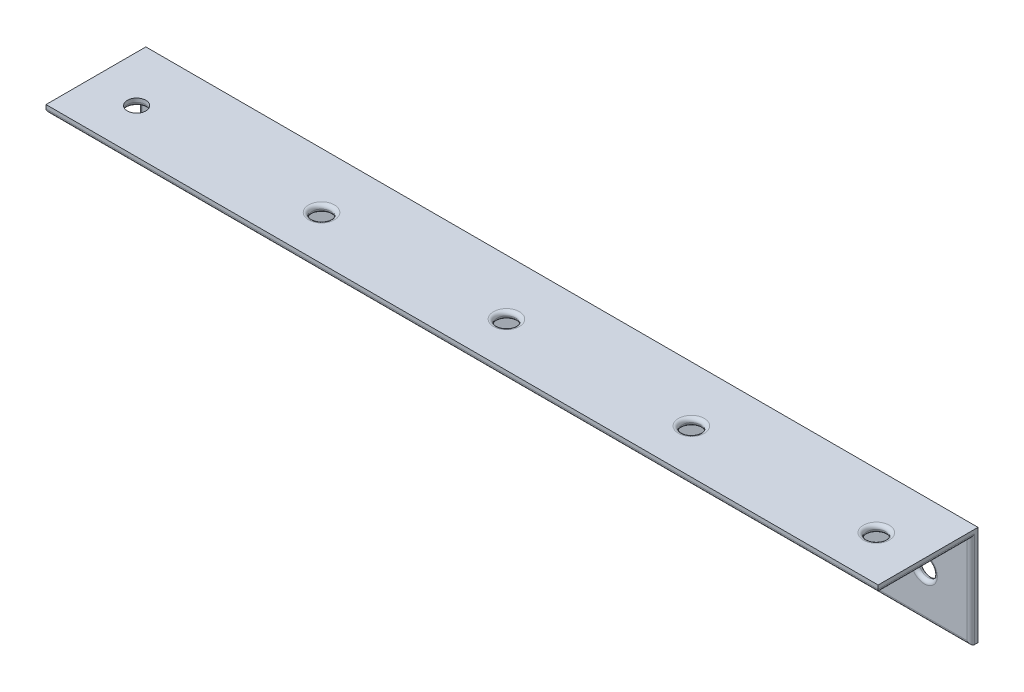
ISO-10303-21;
HEADER;
FILE_DESCRIPTION(('STEP AP214'),'2;1');
FILE_NAME('part.step','',(''),(''),'','','');
FILE_SCHEMA(('AUTOMOTIVE_DESIGN { 1 0 10303 214 1 1 1 1 }'));
ENDSEC;
DATA;
#1=APPLICATION_CONTEXT('core data for automotive mechanical design processes');
#2=APPLICATION_PROTOCOL_DEFINITION('international standard','automotive_design',2000,#1);
#3=PRODUCT_CONTEXT('',#1,'mechanical');
#4=PRODUCT('Part','Part','',(#3));
#5=PRODUCT_RELATED_PRODUCT_CATEGORY('part','',(#4));
#6=PRODUCT_DEFINITION_FORMATION('','',#4);
#7=PRODUCT_DEFINITION_CONTEXT('part definition',#1,'design');
#8=PRODUCT_DEFINITION('design','',#6,#7);
#9=PRODUCT_DEFINITION_SHAPE('','',#8);
#10=(LENGTH_UNIT() NAMED_UNIT(*) SI_UNIT(.MILLI.,.METRE.));
#11=(NAMED_UNIT(*) PLANE_ANGLE_UNIT() SI_UNIT($,.RADIAN.));
#12=(NAMED_UNIT(*) SI_UNIT($,.STERADIAN.) SOLID_ANGLE_UNIT());
#13=UNCERTAINTY_MEASURE_WITH_UNIT(LENGTH_MEASURE(1.E-05),#10,'distance_accuracy_value','');
#14=(GEOMETRIC_REPRESENTATION_CONTEXT(3) GLOBAL_UNCERTAINTY_ASSIGNED_CONTEXT((#13)) GLOBAL_UNIT_ASSIGNED_CONTEXT((#10,
#11,#12)) REPRESENTATION_CONTEXT('',''));
#15=CARTESIAN_POINT('',(0.,0.,0.));
#16=DIRECTION('',(0.,0.,1.));
#17=DIRECTION('',(1.,0.,0.));
#18=AXIS2_PLACEMENT_3D('',#15,#16,#17);
#19=CARTESIAN_POINT('',(0.,0.,1.));
#20=DIRECTION('',(0.,0.,1.));
#21=DIRECTION('',(1.,0.,0.));
#22=AXIS2_PLACEMENT_3D('',#19,#20,#21);
#23=PLANE('',#22);
#24=CARTESIAN_POINT('',(-50.,-1.5,1.));
#25=DIRECTION('',(0.,0.,1.));
#26=DIRECTION('',(1.,0.,0.));
#27=AXIS2_PLACEMENT_3D('',#24,#25,#26);
#28=CIRCLE('',#27,3.5);
#29=CARTESIAN_POINT('',(-46.5,-1.5,1.));
#30=VERTEX_POINT('',#29);
#31=EDGE_CURVE('E169',#30,#30,#28,.F.);
#32=ORIENTED_EDGE('',*,*,#31,.T.);
#33=EDGE_LOOP('',(#32));
#34=FACE_BOUND('',#33,.T.);
#35=CARTESIAN_POINT('',(100.,-1.5,1.));
#36=DIRECTION('',(0.,0.,1.));
#37=DIRECTION('',(1.,0.,0.));
#38=AXIS2_PLACEMENT_3D('',#35,#36,#37);
#39=CIRCLE('',#38,3.5);
#40=CARTESIAN_POINT('',(103.5,-1.5,1.));
#41=VERTEX_POINT('',#40);
#42=EDGE_CURVE('E166',#41,#41,#39,.F.);
#43=ORIENTED_EDGE('',*,*,#42,.T.);
#44=EDGE_LOOP('',(#43));
#45=FACE_BOUND('',#44,.T.);
#46=CARTESIAN_POINT('',(0.,-1.5,1.));
#47=DIRECTION('',(0.,0.,1.));
#48=DIRECTION('',(1.,0.,0.));
#49=AXIS2_PLACEMENT_3D('',#46,#47,#48);
#50=CIRCLE('',#49,3.5);
#51=CARTESIAN_POINT('',(3.5,-1.5,1.));
#52=VERTEX_POINT('',#51);
#53=EDGE_CURVE('E163',#52,#52,#50,.F.);
#54=ORIENTED_EDGE('',*,*,#53,.T.);
#55=EDGE_LOOP('',(#54));
#56=FACE_BOUND('',#55,.T.);
#57=CARTESIAN_POINT('',(50.,-1.5,1.));
#58=DIRECTION('',(0.,0.,1.));
#59=DIRECTION('',(1.,0.,0.));
#60=AXIS2_PLACEMENT_3D('',#57,#58,#59);
#61=CIRCLE('',#60,3.5);
#62=CARTESIAN_POINT('',(53.5,-1.5,1.));
#63=VERTEX_POINT('',#62);
#64=EDGE_CURVE('E153',#63,#63,#61,.F.);
#65=ORIENTED_EDGE('',*,*,#64,.T.);
#66=EDGE_LOOP('',(#65));
#67=FACE_BOUND('',#66,.T.);
#68=CARTESIAN_POINT('',(-100.,-1.5,1.));
#69=DIRECTION('',(0.,0.,1.));
#70=DIRECTION('',(1.,0.,0.));
#71=AXIS2_PLACEMENT_3D('',#68,#69,#70);
#72=CIRCLE('',#71,3.5);
#73=CARTESIAN_POINT('',(-96.5,-1.5,1.));
#74=VERTEX_POINT('',#73);
#75=EDGE_CURVE('E150',#74,#74,#72,.F.);
#76=ORIENTED_EDGE('',*,*,#75,.T.);
#77=EDGE_LOOP('',(#76));
#78=FACE_BOUND('',#77,.T.);
#79=DIRECTION('',(1.,0.,0.));
#80=VECTOR('',#79,1.);
#81=CARTESIAN_POINT('',(-112.5,11.5,1.));
#82=LINE('',#81,#80);
#83=CARTESIAN_POINT('',(-111.5,11.5,1.));
#84=VERTEX_POINT('',#83);
#85=CARTESIAN_POINT('',(111.5,11.5,1.));
#86=VERTEX_POINT('',#85);
#87=EDGE_CURVE('E130',#84,#86,#82,.T.);
#88=ORIENTED_EDGE('',*,*,#87,.F.);
#89=DIRECTION('',(0.,-1.,0.));
#90=VECTOR('',#89,1.);
#91=CARTESIAN_POINT('',(-111.5,-13.5,1.));
#92=LINE('',#91,#90);
#93=CARTESIAN_POINT('',(-111.5,-12.5,1.));
#94=VERTEX_POINT('',#93);
#95=EDGE_CURVE('E160',#84,#94,#92,.T.);
#96=ORIENTED_EDGE('',*,*,#95,.T.);
#97=DIRECTION('',(1.,0.,0.));
#98=VECTOR('',#97,1.);
#99=CARTESIAN_POINT('',(112.5,-12.5,1.));
#100=LINE('',#99,#98);
#101=CARTESIAN_POINT('',(111.5,-12.5,1.));
#102=VERTEX_POINT('',#101);
#103=EDGE_CURVE('E158',#94,#102,#100,.T.);
#104=ORIENTED_EDGE('',*,*,#103,.T.);
#105=DIRECTION('',(0.,1.,0.));
#106=VECTOR('',#105,1.);
#107=CARTESIAN_POINT('',(111.5,11.5,1.));
#108=LINE('',#107,#106);
#109=EDGE_CURVE('E156',#102,#86,#108,.T.);
#110=ORIENTED_EDGE('',*,*,#109,.T.);
#111=EDGE_LOOP('',(#88,#96,#104,#110));
#112=FACE_BOUND('',#111,.T.);
#113=ADVANCED_FACE('F33',(#34,#45,#56,#67,#78,#112),#23,.T.);
#114=CARTESIAN_POINT('',(0.,0.,-1.));
#115=DIRECTION('',(0.,0.,1.));
#116=DIRECTION('',(1.,0.,0.));
#117=AXIS2_PLACEMENT_3D('',#114,#115,#116);
#118=PLANE('',#117);
#119=CARTESIAN_POINT('',(100.,-1.5,-1.));
#120=DIRECTION('',(0.,0.,1.));
#121=DIRECTION('',(1.,0.,0.));
#122=AXIS2_PLACEMENT_3D('',#119,#120,#121);
#123=CIRCLE('',#122,3.5);
#124=CARTESIAN_POINT('',(103.5,-1.5,-1.));
#125=VERTEX_POINT('',#124);
#126=EDGE_CURVE('E214',#125,#125,#123,.T.);
#127=ORIENTED_EDGE('',*,*,#126,.T.);
#128=EDGE_LOOP('',(#127));
#129=FACE_BOUND('',#128,.T.);
#130=CARTESIAN_POINT('',(0.,-1.5,-1.));
#131=DIRECTION('',(0.,0.,1.));
#132=DIRECTION('',(1.,0.,0.));
#133=AXIS2_PLACEMENT_3D('',#130,#131,#132);
#134=CIRCLE('',#133,3.5);
#135=CARTESIAN_POINT('',(3.5,-1.5,-1.));
#136=VERTEX_POINT('',#135);
#137=EDGE_CURVE('E211',#136,#136,#134,.T.);
#138=ORIENTED_EDGE('',*,*,#137,.T.);
#139=EDGE_LOOP('',(#138));
#140=FACE_BOUND('',#139,.T.);
#141=CARTESIAN_POINT('',(50.,-1.5,-1.));
#142=DIRECTION('',(0.,0.,1.));
#143=DIRECTION('',(1.,0.,0.));
#144=AXIS2_PLACEMENT_3D('',#141,#142,#143);
#145=CIRCLE('',#144,3.5);
#146=CARTESIAN_POINT('',(53.5,-1.5,-1.));
#147=VERTEX_POINT('',#146);
#148=EDGE_CURVE('E208',#147,#147,#145,.T.);
#149=ORIENTED_EDGE('',*,*,#148,.T.);
#150=EDGE_LOOP('',(#149));
#151=FACE_BOUND('',#150,.T.);
#152=CARTESIAN_POINT('',(-100.,-1.5,-1.));
#153=DIRECTION('',(0.,0.,1.));
#154=DIRECTION('',(1.,0.,0.));
#155=AXIS2_PLACEMENT_3D('',#152,#153,#154);
#156=CIRCLE('',#155,3.5);
#157=CARTESIAN_POINT('',(-96.5,-1.5,-1.));
#158=VERTEX_POINT('',#157);
#159=EDGE_CURVE('E205',#158,#158,#156,.T.);
#160=ORIENTED_EDGE('',*,*,#159,.T.);
#161=EDGE_LOOP('',(#160));
#162=FACE_BOUND('',#161,.T.);
#163=DIRECTION('',(0.,1.,0.));
#164=VECTOR('',#163,1.);
#165=CARTESIAN_POINT('',(112.5,13.5,-1.));
#166=LINE('',#165,#164);
#167=CARTESIAN_POINT('',(112.5,-13.5,-1.));
#168=VERTEX_POINT('',#167);
#169=CARTESIAN_POINT('',(112.5,13.5,-1.));
#170=VERTEX_POINT('',#169);
#171=EDGE_CURVE('E117',#168,#170,#166,.T.);
#172=ORIENTED_EDGE('',*,*,#171,.F.);
#173=DIRECTION('',(1.,0.,0.));
#174=VECTOR('',#173,1.);
#175=CARTESIAN_POINT('',(-112.5,-13.5,-1.));
#176=LINE('',#175,#174);
#177=CARTESIAN_POINT('',(-112.5,-13.5,-1.));
#178=VERTEX_POINT('',#177);
#179=EDGE_CURVE('E140',#178,#168,#176,.T.);
#180=ORIENTED_EDGE('',*,*,#179,.F.);
#181=DIRECTION('',(0.,-1.,0.));
#182=VECTOR('',#181,1.);
#183=CARTESIAN_POINT('',(-112.5,13.5,-1.));
#184=LINE('',#183,#182);
#185=CARTESIAN_POINT('',(-112.5,13.5,-1.));
#186=VERTEX_POINT('',#185);
#187=EDGE_CURVE('E137',#186,#178,#184,.T.);
#188=ORIENTED_EDGE('',*,*,#187,.F.);
#189=DIRECTION('',(-1.,0.,0.));
#190=VECTOR('',#189,1.);
#191=CARTESIAN_POINT('',(-112.5,13.5,-1.));
#192=LINE('',#191,#190);
#193=EDGE_CURVE('E135',#170,#186,#192,.T.);
#194=ORIENTED_EDGE('',*,*,#193,.F.);
#195=EDGE_LOOP('',(#172,#180,#188,#194));
#196=FACE_BOUND('',#195,.T.);
#197=CARTESIAN_POINT('',(-50.,-1.5,-1.));
#198=DIRECTION('',(0.,0.,1.));
#199=DIRECTION('',(1.,0.,0.));
#200=AXIS2_PLACEMENT_3D('',#197,#198,#199);
#201=CIRCLE('',#200,2.5);
#202=CARTESIAN_POINT('',(-47.5,-1.5,-1.));
#203=VERTEX_POINT('',#202);
#204=EDGE_CURVE('E124',#203,#203,#201,.T.);
#205=ORIENTED_EDGE('',*,*,#204,.T.);
#206=EDGE_LOOP('',(#205));
#207=FACE_BOUND('',#206,.T.);
#208=ADVANCED_FACE('F283',(#129,#140,#151,#162,#196,#207),#118,.F.);
#209=CARTESIAN_POINT('',(112.5,13.5,1.));
#210=DIRECTION('',(-1.,0.,0.));
#211=DIRECTION('',(0.,0.,1.));
#212=AXIS2_PLACEMENT_3D('',#209,#210,#211);
#213=PLANE('',#212);
#214=DIRECTION('',(0.,0.,-1.));
#215=VECTOR('',#214,1.);
#216=CARTESIAN_POINT('',(112.5,12.5,1.));
#217=LINE('',#216,#215);
#218=CARTESIAN_POINT('',(112.5,12.5,26.));
#219=VERTEX_POINT('',#218);
#220=CARTESIAN_POINT('',(112.5,12.5,0.));
#221=VERTEX_POINT('',#220);
#222=EDGE_CURVE('E50',#219,#221,#217,.T.);
#223=ORIENTED_EDGE('',*,*,#222,.T.);
#224=DIRECTION('',(0.,1.,0.));
#225=VECTOR('',#224,1.);
#226=CARTESIAN_POINT('',(112.5,-13.5,0.));
#227=LINE('',#226,#225);
#228=CARTESIAN_POINT('',(112.5,-13.5,0.));
#229=VERTEX_POINT('',#228);
#230=EDGE_CURVE('E225',#221,#229,#227,.F.);
#231=ORIENTED_EDGE('',*,*,#230,.T.);
#232=DIRECTION('',(0.,0.,-1.));
#233=VECTOR('',#232,1.);
#234=CARTESIAN_POINT('',(112.5,-13.5,1.));
#235=LINE('',#234,#233);
#236=EDGE_CURVE('E143',#229,#168,#235,.T.);
#237=ORIENTED_EDGE('',*,*,#236,.T.);
#238=ORIENTED_EDGE('',*,*,#171,.T.);
#239=DIRECTION('',(0.,0.,-1.));
#240=VECTOR('',#239,1.);
#241=CARTESIAN_POINT('',(112.5,13.5,1.));
#242=LINE('',#241,#240);
#243=CARTESIAN_POINT('',(112.5,13.5,26.));
#244=VERTEX_POINT('',#243);
#245=EDGE_CURVE('E114',#244,#170,#242,.T.);
#246=ORIENTED_EDGE('',*,*,#245,.F.);
#247=DIRECTION('',(0.,1.,0.));
#248=VECTOR('',#247,1.);
#249=CARTESIAN_POINT('',(112.5,13.5,26.));
#250=LINE('',#249,#248);
#251=EDGE_CURVE('E104',#219,#244,#250,.T.);
#252=ORIENTED_EDGE('',*,*,#251,.F.);
#253=EDGE_LOOP('',(#223,#231,#237,#238,#246,#252));
#254=FACE_BOUND('',#253,.T.);
#255=ADVANCED_FACE('F115',(#254),#213,.F.);
#256=CARTESIAN_POINT('',(-112.5,13.5,1.));
#257=DIRECTION('',(0.,-1.,0.));
#258=DIRECTION('',(0.,0.,-1.));
#259=AXIS2_PLACEMENT_3D('',#256,#257,#258);
#260=PLANE('',#259);
#261=CARTESIAN_POINT('',(100.,13.5,14.));
#262=DIRECTION('',(0.,-1.,0.));
#263=DIRECTION('',(0.,0.,-1.));
#264=AXIS2_PLACEMENT_3D('',#261,#262,#263);
#265=CIRCLE('',#264,3.5);
#266=CARTESIAN_POINT('',(100.,13.5,10.5));
#267=VERTEX_POINT('',#266);
#268=EDGE_CURVE('E202',#267,#267,#265,.T.);
#269=ORIENTED_EDGE('',*,*,#268,.T.);
#270=EDGE_LOOP('',(#269));
#271=FACE_BOUND('',#270,.T.);
#272=CARTESIAN_POINT('',(50.,13.5,14.));
#273=DIRECTION('',(0.,-1.,0.));
#274=DIRECTION('',(0.,0.,-1.));
#275=AXIS2_PLACEMENT_3D('',#272,#273,#274);
#276=CIRCLE('',#275,3.5);
#277=CARTESIAN_POINT('',(50.,13.5,10.5));
#278=VERTEX_POINT('',#277);
#279=EDGE_CURVE('E199',#278,#278,#276,.T.);
#280=ORIENTED_EDGE('',*,*,#279,.T.);
#281=EDGE_LOOP('',(#280));
#282=FACE_BOUND('',#281,.T.);
#283=CARTESIAN_POINT('',(0.,13.5,14.));
#284=DIRECTION('',(0.,-1.,0.));
#285=DIRECTION('',(0.,0.,-1.));
#286=AXIS2_PLACEMENT_3D('',#283,#284,#285);
#287=CIRCLE('',#286,3.5);
#288=CARTESIAN_POINT('',(0.,13.5,10.5));
#289=VERTEX_POINT('',#288);
#290=EDGE_CURVE('E196',#289,#289,#287,.T.);
#291=ORIENTED_EDGE('',*,*,#290,.T.);
#292=EDGE_LOOP('',(#291));
#293=FACE_BOUND('',#292,.T.);
#294=CARTESIAN_POINT('',(-50.,13.5,14.));
#295=DIRECTION('',(0.,-1.,0.));
#296=DIRECTION('',(0.,0.,-1.));
#297=AXIS2_PLACEMENT_3D('',#294,#295,#296);
#298=CIRCLE('',#297,3.5);
#299=CARTESIAN_POINT('',(-50.,13.5,10.5));
#300=VERTEX_POINT('',#299);
#301=EDGE_CURVE('E193',#300,#300,#298,.T.);
#302=ORIENTED_EDGE('',*,*,#301,.T.);
#303=EDGE_LOOP('',(#302));
#304=FACE_BOUND('',#303,.T.);
#305=CARTESIAN_POINT('',(-100.,13.5,14.));
#306=DIRECTION('',(0.,-1.,0.));
#307=DIRECTION('',(0.,0.,-1.));
#308=AXIS2_PLACEMENT_3D('',#305,#306,#307);
#309=CIRCLE('',#308,2.5);
#310=CARTESIAN_POINT('',(-100.,13.5,11.5));
#311=VERTEX_POINT('',#310);
#312=EDGE_CURVE('E132',#311,#311,#309,.T.);
#313=ORIENTED_EDGE('',*,*,#312,.T.);
#314=EDGE_LOOP('',(#313));
#315=FACE_BOUND('',#314,.T.);
#316=ORIENTED_EDGE('',*,*,#193,.T.);
#317=DIRECTION('',(0.,0.,-1.));
#318=VECTOR('',#317,1.);
#319=CARTESIAN_POINT('',(-112.5,13.5,1.));
#320=LINE('',#319,#318);
#321=CARTESIAN_POINT('',(-112.5,13.5,26.));
#322=VERTEX_POINT('',#321);
#323=EDGE_CURVE('E120',#322,#186,#320,.T.);
#324=ORIENTED_EDGE('',*,*,#323,.F.);
#325=DIRECTION('',(-1.,0.,0.));
#326=VECTOR('',#325,1.);
#327=CARTESIAN_POINT('',(-112.5,13.5,26.));
#328=LINE('',#327,#326);
#329=EDGE_CURVE('E108',#244,#322,#328,.T.);
#330=ORIENTED_EDGE('',*,*,#329,.F.);
#331=ORIENTED_EDGE('',*,*,#245,.T.);
#332=EDGE_LOOP('',(#316,#324,#330,#331));
#333=FACE_BOUND('',#332,.T.);
#334=ADVANCED_FACE('F122',(#271,#282,#293,#304,#315,#333),#260,.F.);
#335=CARTESIAN_POINT('',(-112.5,13.5,1.));
#336=DIRECTION('',(1.,0.,0.));
#337=DIRECTION('',(0.,0.,-1.));
#338=AXIS2_PLACEMENT_3D('',#335,#336,#337);
#339=PLANE('',#338);
#340=DIRECTION('',(0.,0.,-1.));
#341=VECTOR('',#340,1.);
#342=CARTESIAN_POINT('',(-112.5,-13.5,1.));
#343=LINE('',#342,#341);
#344=CARTESIAN_POINT('',(-112.5,-13.5,0.));
#345=VERTEX_POINT('',#344);
#346=EDGE_CURVE('E145',#345,#178,#343,.T.);
#347=ORIENTED_EDGE('',*,*,#346,.F.);
#348=DIRECTION('',(0.,-1.,0.));
#349=VECTOR('',#348,1.);
#350=CARTESIAN_POINT('',(-112.5,11.5,0.));
#351=LINE('',#350,#349);
#352=CARTESIAN_POINT('',(-112.5,12.5,0.));
#353=VERTEX_POINT('',#352);
#354=EDGE_CURVE('E219',#345,#353,#351,.F.);
#355=ORIENTED_EDGE('',*,*,#354,.T.);
#356=DIRECTION('',(0.,0.,-1.));
#357=VECTOR('',#356,1.);
#358=CARTESIAN_POINT('',(-112.5,12.5,1.));
#359=LINE('',#358,#357);
#360=CARTESIAN_POINT('',(-112.5,12.5,26.));
#361=VERTEX_POINT('',#360);
#362=EDGE_CURVE('E217',#353,#361,#359,.F.);
#363=ORIENTED_EDGE('',*,*,#362,.T.);
#364=DIRECTION('',(0.,-1.,0.));
#365=VECTOR('',#364,1.);
#366=CARTESIAN_POINT('',(-112.5,13.5,26.));
#367=LINE('',#366,#365);
#368=EDGE_CURVE('E110',#322,#361,#367,.T.);
#369=ORIENTED_EDGE('',*,*,#368,.F.);
#370=ORIENTED_EDGE('',*,*,#323,.T.);
#371=ORIENTED_EDGE('',*,*,#187,.T.);
#372=EDGE_LOOP('',(#347,#355,#363,#369,#370,#371));
#373=FACE_BOUND('',#372,.T.);
#374=ADVANCED_FACE('F299',(#373),#339,.F.);
#375=CARTESIAN_POINT('',(-112.5,-13.5,1.));
#376=DIRECTION('',(0.,1.,0.));
#377=DIRECTION('',(0.,0.,1.));
#378=AXIS2_PLACEMENT_3D('',#375,#376,#377);
#379=PLANE('',#378);
#380=ORIENTED_EDGE('',*,*,#236,.F.);
#381=DIRECTION('',(1.,0.,0.));
#382=VECTOR('',#381,1.);
#383=CARTESIAN_POINT('',(-112.5,-13.5,0.));
#384=LINE('',#383,#382);
#385=EDGE_CURVE('E222',#229,#345,#384,.F.);
#386=ORIENTED_EDGE('',*,*,#385,.T.);
#387=ORIENTED_EDGE('',*,*,#346,.T.);
#388=ORIENTED_EDGE('',*,*,#179,.T.);
#389=EDGE_LOOP('',(#380,#386,#387,#388));
#390=FACE_BOUND('',#389,.T.);
#391=ADVANCED_FACE('F296',(#390),#379,.F.);
#392=CARTESIAN_POINT('',(-50.,-1.5,1.));
#393=DIRECTION('',(0.,0.,-1.));
#394=DIRECTION('',(-1.,0.,0.));
#395=AXIS2_PLACEMENT_3D('',#392,#393,#394);
#396=CYLINDRICAL_SURFACE('',#395,2.5);
#397=CARTESIAN_POINT('',(-50.,-1.5,0.));
#398=DIRECTION('',(0.,0.,1.));
#399=DIRECTION('',(1.,0.,0.));
#400=AXIS2_PLACEMENT_3D('',#397,#398,#399);
#401=CIRCLE('',#400,2.5);
#402=CARTESIAN_POINT('',(-47.5,-1.5,0.));
#403=VERTEX_POINT('',#402);
#404=EDGE_CURVE('E119',#403,#403,#401,.T.);
#405=ORIENTED_EDGE('',*,*,#404,.T.);
#406=EDGE_LOOP('',(#405));
#407=FACE_BOUND('',#406,.T.);
#408=ORIENTED_EDGE('',*,*,#204,.F.);
#409=EDGE_LOOP('',(#408));
#410=FACE_BOUND('',#409,.T.);
#411=ADVANCED_FACE('F293',(#407,#410),#396,.F.);
#412=CARTESIAN_POINT('',(-112.5,11.5,26.));
#413=DIRECTION('',(0.,1.,0.));
#414=DIRECTION('',(0.,0.,1.));
#415=AXIS2_PLACEMENT_3D('',#412,#413,#414);
#416=PLANE('',#415);
#417=CARTESIAN_POINT('',(100.,11.5,14.));
#418=DIRECTION('',(0.,1.,0.));
#419=DIRECTION('',(0.,0.,1.));
#420=AXIS2_PLACEMENT_3D('',#417,#418,#419);
#421=CIRCLE('',#420,3.5);
#422=CARTESIAN_POINT('',(100.,11.5,17.5));
#423=VERTEX_POINT('',#422);
#424=EDGE_CURVE('E190',#423,#423,#421,.T.);
#425=ORIENTED_EDGE('',*,*,#424,.T.);
#426=EDGE_LOOP('',(#425));
#427=FACE_BOUND('',#426,.T.);
#428=CARTESIAN_POINT('',(50.,11.5,14.));
#429=DIRECTION('',(0.,1.,0.));
#430=DIRECTION('',(0.,0.,1.));
#431=AXIS2_PLACEMENT_3D('',#428,#429,#430);
#432=CIRCLE('',#431,3.5);
#433=CARTESIAN_POINT('',(50.,11.5,17.5));
#434=VERTEX_POINT('',#433);
#435=EDGE_CURVE('E187',#434,#434,#432,.T.);
#436=ORIENTED_EDGE('',*,*,#435,.T.);
#437=EDGE_LOOP('',(#436));
#438=FACE_BOUND('',#437,.T.);
#439=CARTESIAN_POINT('',(0.,11.5,14.));
#440=DIRECTION('',(0.,1.,0.));
#441=DIRECTION('',(0.,0.,1.));
#442=AXIS2_PLACEMENT_3D('',#439,#440,#441);
#443=CIRCLE('',#442,3.5);
#444=CARTESIAN_POINT('',(0.,11.5,17.5));
#445=VERTEX_POINT('',#444);
#446=EDGE_CURVE('E184',#445,#445,#443,.T.);
#447=ORIENTED_EDGE('',*,*,#446,.T.);
#448=EDGE_LOOP('',(#447));
#449=FACE_BOUND('',#448,.T.);
#450=CARTESIAN_POINT('',(-50.,11.5,14.));
#451=DIRECTION('',(0.,1.,0.));
#452=DIRECTION('',(0.,0.,1.));
#453=AXIS2_PLACEMENT_3D('',#450,#451,#452);
#454=CIRCLE('',#453,3.5);
#455=CARTESIAN_POINT('',(-50.,11.5,17.5));
#456=VERTEX_POINT('',#455);
#457=EDGE_CURVE('E181',#456,#456,#454,.T.);
#458=ORIENTED_EDGE('',*,*,#457,.T.);
#459=EDGE_LOOP('',(#458));
#460=FACE_BOUND('',#459,.T.);
#461=CARTESIAN_POINT('',(-100.,11.5,14.));
#462=DIRECTION('',(0.,1.,0.));
#463=DIRECTION('',(0.,0.,1.));
#464=AXIS2_PLACEMENT_3D('',#461,#462,#463);
#465=CIRCLE('',#464,3.5);
#466=CARTESIAN_POINT('',(-100.,11.5,17.5));
#467=VERTEX_POINT('',#466);
#468=EDGE_CURVE('E172',#467,#467,#465,.T.);
#469=ORIENTED_EDGE('',*,*,#468,.T.);
#470=EDGE_LOOP('',(#469));
#471=FACE_BOUND('',#470,.T.);
#472=DIRECTION('',(1.,0.,0.));
#473=VECTOR('',#472,1.);
#474=CARTESIAN_POINT('',(-112.5,11.5,25.));
#475=LINE('',#474,#473);
#476=CARTESIAN_POINT('',(111.5,11.5,25.));
#477=VERTEX_POINT('',#476);
#478=CARTESIAN_POINT('',(-111.5,11.5,25.));
#479=VERTEX_POINT('',#478);
#480=EDGE_CURVE('E175',#477,#479,#475,.F.);
#481=ORIENTED_EDGE('',*,*,#480,.T.);
#482=DIRECTION('',(0.,0.,-1.));
#483=VECTOR('',#482,1.);
#484=CARTESIAN_POINT('',(-111.5,11.5,26.));
#485=LINE('',#484,#483);
#486=EDGE_CURVE('E179',#479,#84,#485,.T.);
#487=ORIENTED_EDGE('',*,*,#486,.T.);
#488=ORIENTED_EDGE('',*,*,#87,.T.);
#489=DIRECTION('',(0.,0.,-1.));
#490=VECTOR('',#489,1.);
#491=CARTESIAN_POINT('',(111.5,11.5,26.));
#492=LINE('',#491,#490);
#493=EDGE_CURVE('E177',#86,#477,#492,.F.);
#494=ORIENTED_EDGE('',*,*,#493,.T.);
#495=EDGE_LOOP('',(#481,#487,#488,#494));
#496=FACE_BOUND('',#495,.T.);
#497=ADVANCED_FACE('F414',(#427,#438,#449,#460,#471,#496),#416,.F.);
#498=CARTESIAN_POINT('',(0.,0.,26.));
#499=DIRECTION('',(0.,0.,1.));
#500=DIRECTION('',(1.,0.,0.));
#501=AXIS2_PLACEMENT_3D('',#498,#499,#500);
#502=PLANE('',#501);
#503=ORIENTED_EDGE('',*,*,#368,.T.);
#504=DIRECTION('',(1.,0.,0.));
#505=VECTOR('',#504,1.);
#506=CARTESIAN_POINT('',(112.5,12.5,26.));
#507=LINE('',#506,#505);
#508=EDGE_CURVE('E42',#361,#219,#507,.T.);
#509=ORIENTED_EDGE('',*,*,#508,.T.);
#510=ORIENTED_EDGE('',*,*,#251,.T.);
#511=ORIENTED_EDGE('',*,*,#329,.T.);
#512=EDGE_LOOP('',(#503,#509,#510,#511));
#513=FACE_BOUND('',#512,.T.);
#514=ADVANCED_FACE('F106',(#513),#502,.T.);
#515=CARTESIAN_POINT('',(-100.,13.5,14.));
#516=DIRECTION('',(0.,-1.,0.));
#517=DIRECTION('',(0.,0.,-1.));
#518=AXIS2_PLACEMENT_3D('',#515,#516,#517);
#519=CYLINDRICAL_SURFACE('',#518,2.5);
#520=CARTESIAN_POINT('',(-100.,12.5,14.));
#521=DIRECTION('',(0.,1.,0.));
#522=DIRECTION('',(0.,0.,1.));
#523=AXIS2_PLACEMENT_3D('',#520,#521,#522);
#524=CIRCLE('',#523,2.5);
#525=CARTESIAN_POINT('',(-100.,12.5,16.5));
#526=VERTEX_POINT('',#525);
#527=EDGE_CURVE('E11',#526,#526,#524,.F.);
#528=ORIENTED_EDGE('',*,*,#527,.T.);
#529=EDGE_LOOP('',(#528));
#530=FACE_BOUND('',#529,.T.);
#531=ORIENTED_EDGE('',*,*,#312,.F.);
#532=EDGE_LOOP('',(#531));
#533=FACE_BOUND('',#532,.T.);
#534=ADVANCED_FACE('F313',(#530,#533),#519,.F.);
#535=CARTESIAN_POINT('',(-50.,-1.5,0.));
#536=DIRECTION('',(0.,0.,1.));
#537=DIRECTION('',(1.,0.,0.));
#538=AXIS2_PLACEMENT_3D('',#535,#536,#537);
#539=TOROIDAL_SURFACE('',#538,3.5,1.);
#540=ORIENTED_EDGE('',*,*,#31,.F.);
#541=EDGE_LOOP('',(#540));
#542=FACE_BOUND('',#541,.T.);
#543=ORIENTED_EDGE('',*,*,#404,.F.);
#544=EDGE_LOOP('',(#543));
#545=FACE_BOUND('',#544,.T.);
#546=ADVANCED_FACE('F309',(#542,#545),#539,.T.);
#547=CARTESIAN_POINT('',(100.,12.5,14.));
#548=DIRECTION('',(0.,-1.,0.));
#549=DIRECTION('',(0.,0.,-1.));
#550=AXIS2_PLACEMENT_3D('',#547,#548,#549);
#551=TOROIDAL_SURFACE('',#550,3.5,1.);
#552=ORIENTED_EDGE('',*,*,#268,.F.);
#553=EDGE_LOOP('',(#552));
#554=FACE_BOUND('',#553,.T.);
#555=CARTESIAN_POINT('',(100.,12.5,14.));
#556=DIRECTION('',(0.,-1.,0.));
#557=DIRECTION('',(0.,0.,-1.));
#558=AXIS2_PLACEMENT_3D('',#555,#556,#557);
#559=CIRCLE('',#558,2.5);
#560=CARTESIAN_POINT('',(100.,12.5,11.5));
#561=VERTEX_POINT('',#560);
#562=EDGE_CURVE('E228',#561,#561,#559,.F.);
#563=ORIENTED_EDGE('',*,*,#562,.F.);
#564=EDGE_LOOP('',(#563));
#565=FACE_BOUND('',#564,.T.);
#566=ADVANCED_FACE('F312',(#554,#565),#551,.T.);
#567=CARTESIAN_POINT('',(100.,12.5,14.));
#568=DIRECTION('',(0.,1.,0.));
#569=DIRECTION('',(0.,0.,1.));
#570=AXIS2_PLACEMENT_3D('',#567,#568,#569);
#571=TOROIDAL_SURFACE('',#570,3.5,1.);
#572=ORIENTED_EDGE('',*,*,#424,.F.);
#573=EDGE_LOOP('',(#572));
#574=FACE_BOUND('',#573,.T.);
#575=ORIENTED_EDGE('',*,*,#562,.T.);
#576=EDGE_LOOP('',(#575));
#577=FACE_BOUND('',#576,.T.);
#578=ADVANCED_FACE('F315',(#574,#577),#571,.T.);
#579=CARTESIAN_POINT('',(100.,-1.5,0.));
#580=DIRECTION('',(0.,0.,1.));
#581=DIRECTION('',(1.,0.,0.));
#582=AXIS2_PLACEMENT_3D('',#579,#580,#581);
#583=TOROIDAL_SURFACE('',#582,3.5,1.);
#584=ORIENTED_EDGE('',*,*,#42,.F.);
#585=EDGE_LOOP('',(#584));
#586=FACE_BOUND('',#585,.T.);
#587=CARTESIAN_POINT('',(100.,-1.5,0.));
#588=DIRECTION('',(0.,0.,1.));
#589=DIRECTION('',(1.,0.,0.));
#590=AXIS2_PLACEMENT_3D('',#587,#588,#589);
#591=CIRCLE('',#590,2.5);
#592=CARTESIAN_POINT('',(102.5,-1.5,0.));
#593=VERTEX_POINT('',#592);
#594=EDGE_CURVE('E231',#593,#593,#591,.T.);
#595=ORIENTED_EDGE('',*,*,#594,.F.);
#596=EDGE_LOOP('',(#595));
#597=FACE_BOUND('',#596,.T.);
#598=ADVANCED_FACE('F318',(#586,#597),#583,.T.);
#599=CARTESIAN_POINT('',(100.,-1.5,0.));
#600=DIRECTION('',(0.,0.,1.));
#601=DIRECTION('',(1.,0.,0.));
#602=AXIS2_PLACEMENT_3D('',#599,#600,#601);
#603=TOROIDAL_SURFACE('',#602,3.5,1.);
#604=ORIENTED_EDGE('',*,*,#594,.T.);
#605=EDGE_LOOP('',(#604));
#606=FACE_BOUND('',#605,.T.);
#607=ORIENTED_EDGE('',*,*,#126,.F.);
#608=EDGE_LOOP('',(#607));
#609=FACE_BOUND('',#608,.T.);
#610=ADVANCED_FACE('F323',(#606,#609),#603,.T.);
#611=CARTESIAN_POINT('',(50.,12.5,14.));
#612=DIRECTION('',(0.,-1.,0.));
#613=DIRECTION('',(0.,0.,-1.));
#614=AXIS2_PLACEMENT_3D('',#611,#612,#613);
#615=TOROIDAL_SURFACE('',#614,3.5,1.);
#616=ORIENTED_EDGE('',*,*,#279,.F.);
#617=EDGE_LOOP('',(#616));
#618=FACE_BOUND('',#617,.T.);
#619=CARTESIAN_POINT('',(50.,12.5,14.));
#620=DIRECTION('',(0.,-1.,0.));
#621=DIRECTION('',(0.,0.,-1.));
#622=AXIS2_PLACEMENT_3D('',#619,#620,#621);
#623=CIRCLE('',#622,2.5);
#624=CARTESIAN_POINT('',(50.,12.5,11.5));
#625=VERTEX_POINT('',#624);
#626=EDGE_CURVE('E234',#625,#625,#623,.F.);
#627=ORIENTED_EDGE('',*,*,#626,.F.);
#628=EDGE_LOOP('',(#627));
#629=FACE_BOUND('',#628,.T.);
#630=ADVANCED_FACE('F326',(#618,#629),#615,.T.);
#631=CARTESIAN_POINT('',(50.,12.5,14.));
#632=DIRECTION('',(0.,1.,0.));
#633=DIRECTION('',(0.,0.,1.));
#634=AXIS2_PLACEMENT_3D('',#631,#632,#633);
#635=TOROIDAL_SURFACE('',#634,3.5,1.);
#636=ORIENTED_EDGE('',*,*,#435,.F.);
#637=EDGE_LOOP('',(#636));
#638=FACE_BOUND('',#637,.T.);
#639=ORIENTED_EDGE('',*,*,#626,.T.);
#640=EDGE_LOOP('',(#639));
#641=FACE_BOUND('',#640,.T.);
#642=ADVANCED_FACE('F331',(#638,#641),#635,.T.);
#643=CARTESIAN_POINT('',(0.,-1.5,0.));
#644=DIRECTION('',(0.,0.,1.));
#645=DIRECTION('',(1.,0.,0.));
#646=AXIS2_PLACEMENT_3D('',#643,#644,#645);
#647=TOROIDAL_SURFACE('',#646,3.5,1.);
#648=ORIENTED_EDGE('',*,*,#53,.F.);
#649=EDGE_LOOP('',(#648));
#650=FACE_BOUND('',#649,.T.);
#651=CARTESIAN_POINT('',(0.,-1.5,0.));
#652=DIRECTION('',(0.,0.,1.));
#653=DIRECTION('',(1.,0.,0.));
#654=AXIS2_PLACEMENT_3D('',#651,#652,#653);
#655=CIRCLE('',#654,2.5);
#656=CARTESIAN_POINT('',(2.5,-1.5,0.));
#657=VERTEX_POINT('',#656);
#658=EDGE_CURVE('E237',#657,#657,#655,.T.);
#659=ORIENTED_EDGE('',*,*,#658,.F.);
#660=EDGE_LOOP('',(#659));
#661=FACE_BOUND('',#660,.T.);
#662=ADVANCED_FACE('F334',(#650,#661),#647,.T.);
#663=CARTESIAN_POINT('',(0.,-1.5,0.));
#664=DIRECTION('',(0.,0.,1.));
#665=DIRECTION('',(1.,0.,0.));
#666=AXIS2_PLACEMENT_3D('',#663,#664,#665);
#667=TOROIDAL_SURFACE('',#666,3.5,1.);
#668=ORIENTED_EDGE('',*,*,#658,.T.);
#669=EDGE_LOOP('',(#668));
#670=FACE_BOUND('',#669,.T.);
#671=ORIENTED_EDGE('',*,*,#137,.F.);
#672=EDGE_LOOP('',(#671));
#673=FACE_BOUND('',#672,.T.);
#674=ADVANCED_FACE('F339',(#670,#673),#667,.T.);
#675=CARTESIAN_POINT('',(0.,12.5,14.));
#676=DIRECTION('',(0.,-1.,0.));
#677=DIRECTION('',(0.,0.,-1.));
#678=AXIS2_PLACEMENT_3D('',#675,#676,#677);
#679=TOROIDAL_SURFACE('',#678,3.5,1.);
#680=ORIENTED_EDGE('',*,*,#290,.F.);
#681=EDGE_LOOP('',(#680));
#682=FACE_BOUND('',#681,.T.);
#683=CARTESIAN_POINT('',(0.,12.5,14.));
#684=DIRECTION('',(0.,-1.,0.));
#685=DIRECTION('',(0.,0.,-1.));
#686=AXIS2_PLACEMENT_3D('',#683,#684,#685);
#687=CIRCLE('',#686,2.5);
#688=CARTESIAN_POINT('',(0.,12.5,11.5));
#689=VERTEX_POINT('',#688);
#690=EDGE_CURVE('E240',#689,#689,#687,.F.);
#691=ORIENTED_EDGE('',*,*,#690,.F.);
#692=EDGE_LOOP('',(#691));
#693=FACE_BOUND('',#692,.T.);
#694=ADVANCED_FACE('F342',(#682,#693),#679,.T.);
#695=CARTESIAN_POINT('',(0.,12.5,14.));
#696=DIRECTION('',(0.,1.,0.));
#697=DIRECTION('',(0.,0.,1.));
#698=AXIS2_PLACEMENT_3D('',#695,#696,#697);
#699=TOROIDAL_SURFACE('',#698,3.5,1.);
#700=ORIENTED_EDGE('',*,*,#446,.F.);
#701=EDGE_LOOP('',(#700));
#702=FACE_BOUND('',#701,.T.);
#703=ORIENTED_EDGE('',*,*,#690,.T.);
#704=EDGE_LOOP('',(#703));
#705=FACE_BOUND('',#704,.T.);
#706=ADVANCED_FACE('F347',(#702,#705),#699,.T.);
#707=CARTESIAN_POINT('',(-50.,12.5,14.));
#708=DIRECTION('',(0.,-1.,0.));
#709=DIRECTION('',(0.,0.,-1.));
#710=AXIS2_PLACEMENT_3D('',#707,#708,#709);
#711=TOROIDAL_SURFACE('',#710,3.5,1.);
#712=ORIENTED_EDGE('',*,*,#301,.F.);
#713=EDGE_LOOP('',(#712));
#714=FACE_BOUND('',#713,.T.);
#715=CARTESIAN_POINT('',(-50.,12.5,14.));
#716=DIRECTION('',(0.,-1.,0.));
#717=DIRECTION('',(0.,0.,-1.));
#718=AXIS2_PLACEMENT_3D('',#715,#716,#717);
#719=CIRCLE('',#718,2.5);
#720=CARTESIAN_POINT('',(-50.,12.5,11.5));
#721=VERTEX_POINT('',#720);
#722=EDGE_CURVE('E243',#721,#721,#719,.F.);
#723=ORIENTED_EDGE('',*,*,#722,.F.);
#724=EDGE_LOOP('',(#723));
#725=FACE_BOUND('',#724,.T.);
#726=ADVANCED_FACE('F350',(#714,#725),#711,.T.);
#727=CARTESIAN_POINT('',(-50.,12.5,14.));
#728=DIRECTION('',(0.,1.,0.));
#729=DIRECTION('',(0.,0.,1.));
#730=AXIS2_PLACEMENT_3D('',#727,#728,#729);
#731=TOROIDAL_SURFACE('',#730,3.5,1.);
#732=ORIENTED_EDGE('',*,*,#457,.F.);
#733=EDGE_LOOP('',(#732));
#734=FACE_BOUND('',#733,.T.);
#735=ORIENTED_EDGE('',*,*,#722,.T.);
#736=EDGE_LOOP('',(#735));
#737=FACE_BOUND('',#736,.T.);
#738=ADVANCED_FACE('F355',(#734,#737),#731,.T.);
#739=CARTESIAN_POINT('',(111.5,12.5,1.));
#740=DIRECTION('',(0.,0.,-1.));
#741=DIRECTION('',(-1.,0.,0.));
#742=AXIS2_PLACEMENT_3D('',#739,#740,#741);
#743=CYLINDRICAL_SURFACE('',#742,1.);
#744=CARTESIAN_POINT('',(111.5,12.5,0.));
#745=DIRECTION('',(0.,-0.707106781186547,-0.707106781186547));
#746=DIRECTION('',(0.,-0.707106781186547,0.707106781186547));
#747=AXIS2_PLACEMENT_3D('',#744,#745,#746);
#748=ELLIPSE('',#747,1.41421356237309,1.);
#749=EDGE_CURVE('E258',#221,#86,#748,.T.);
#750=ORIENTED_EDGE('',*,*,#749,.F.);
#751=ORIENTED_EDGE('',*,*,#222,.F.);
#752=CARTESIAN_POINT('',(111.5,12.5,25.));
#753=DIRECTION('',(-0.707106781186547,0.,0.707106781186547));
#754=DIRECTION('',(-0.707106781186547,0.,-0.707106781186547));
#755=AXIS2_PLACEMENT_3D('',#752,#753,#754);
#756=ELLIPSE('',#755,1.41421356237309,1.);
#757=EDGE_CURVE('E246',#477,#219,#756,.T.);
#758=ORIENTED_EDGE('',*,*,#757,.F.);
#759=ORIENTED_EDGE('',*,*,#493,.F.);
#760=EDGE_LOOP('',(#750,#751,#758,#759));
#761=FACE_BOUND('',#760,.T.);
#762=ADVANCED_FACE('F358',(#761),#743,.T.);
#763=CARTESIAN_POINT('',(0.,12.5,25.));
#764=DIRECTION('',(-1.,0.,0.));
#765=DIRECTION('',(0.,0.,1.));
#766=AXIS2_PLACEMENT_3D('',#763,#764,#765);
#767=CYLINDRICAL_SURFACE('',#766,1.);
#768=ORIENTED_EDGE('',*,*,#757,.T.);
#769=ORIENTED_EDGE('',*,*,#508,.F.);
#770=CARTESIAN_POINT('',(-111.5,12.5,25.));
#771=DIRECTION('',(-0.707106781186547,0.,-0.707106781186547));
#772=DIRECTION('',(-0.707106781186547,0.,0.707106781186547));
#773=AXIS2_PLACEMENT_3D('',#770,#771,#772);
#774=ELLIPSE('',#773,1.41421356237309,1.);
#775=EDGE_CURVE('E255',#479,#361,#774,.T.);
#776=ORIENTED_EDGE('',*,*,#775,.F.);
#777=ORIENTED_EDGE('',*,*,#480,.F.);
#778=EDGE_LOOP('',(#768,#769,#776,#777));
#779=FACE_BOUND('',#778,.T.);
#780=ADVANCED_FACE('F379',(#779),#767,.T.);
#781=CARTESIAN_POINT('',(111.5,0.,0.));
#782=DIRECTION('',(0.,-1.,0.));
#783=DIRECTION('',(0.,0.,-1.));
#784=AXIS2_PLACEMENT_3D('',#781,#782,#783);
#785=CYLINDRICAL_SURFACE('',#784,1.);
#786=ORIENTED_EDGE('',*,*,#749,.T.);
#787=ORIENTED_EDGE('',*,*,#109,.F.);
#788=CARTESIAN_POINT('',(111.5,-12.5,0.));
#789=DIRECTION('',(-0.707106781186547,-0.707106781186547,0.));
#790=DIRECTION('',(0.707106781186547,-0.707106781186547,0.));
#791=AXIS2_PLACEMENT_3D('',#788,#789,#790);
#792=ELLIPSE('',#791,1.41421356237309,1.);
#793=EDGE_CURVE('E252',#229,#102,#792,.T.);
#794=ORIENTED_EDGE('',*,*,#793,.F.);
#795=ORIENTED_EDGE('',*,*,#230,.F.);
#796=EDGE_LOOP('',(#786,#787,#794,#795));
#797=FACE_BOUND('',#796,.T.);
#798=ADVANCED_FACE('F375',(#797),#785,.T.);
#799=CARTESIAN_POINT('',(-111.5,12.5,26.));
#800=DIRECTION('',(0.,0.,-1.));
#801=DIRECTION('',(-1.,0.,0.));
#802=AXIS2_PLACEMENT_3D('',#799,#800,#801);
#803=CYLINDRICAL_SURFACE('',#802,1.);
#804=ORIENTED_EDGE('',*,*,#775,.T.);
#805=ORIENTED_EDGE('',*,*,#362,.F.);
#806=CARTESIAN_POINT('',(-111.5,12.5,0.));
#807=DIRECTION('',(0.,0.707106781186547,0.707106781186547));
#808=DIRECTION('',(0.,0.707106781186547,-0.707106781186547));
#809=AXIS2_PLACEMENT_3D('',#806,#807,#808);
#810=ELLIPSE('',#809,1.41421356237309,1.);
#811=EDGE_CURVE('E249',#84,#353,#810,.F.);
#812=ORIENTED_EDGE('',*,*,#811,.F.);
#813=ORIENTED_EDGE('',*,*,#486,.F.);
#814=EDGE_LOOP('',(#804,#805,#812,#813));
#815=FACE_BOUND('',#814,.T.);
#816=ADVANCED_FACE('F371',(#815),#803,.T.);
#817=CARTESIAN_POINT('',(0.,-12.5,0.));
#818=DIRECTION('',(-1.,0.,0.));
#819=DIRECTION('',(0.,0.,1.));
#820=AXIS2_PLACEMENT_3D('',#817,#818,#819);
#821=CYLINDRICAL_SURFACE('',#820,1.);
#822=ORIENTED_EDGE('',*,*,#793,.T.);
#823=ORIENTED_EDGE('',*,*,#103,.F.);
#824=CARTESIAN_POINT('',(-111.5,-12.5,0.));
#825=DIRECTION('',(-0.707106781186547,0.707106781186547,0.));
#826=DIRECTION('',(-0.707106781186547,-0.707106781186547,0.));
#827=AXIS2_PLACEMENT_3D('',#824,#825,#826);
#828=ELLIPSE('',#827,1.41421356237309,1.);
#829=EDGE_CURVE('E247',#345,#94,#828,.T.);
#830=ORIENTED_EDGE('',*,*,#829,.F.);
#831=ORIENTED_EDGE('',*,*,#385,.F.);
#832=EDGE_LOOP('',(#822,#823,#830,#831));
#833=FACE_BOUND('',#832,.T.);
#834=ADVANCED_FACE('F367',(#833),#821,.T.);
#835=CARTESIAN_POINT('',(-111.5,0.,0.));
#836=DIRECTION('',(0.,1.,0.));
#837=DIRECTION('',(0.,0.,1.));
#838=AXIS2_PLACEMENT_3D('',#835,#836,#837);
#839=CYLINDRICAL_SURFACE('',#838,1.);
#840=ORIENTED_EDGE('',*,*,#811,.T.);
#841=ORIENTED_EDGE('',*,*,#354,.F.);
#842=ORIENTED_EDGE('',*,*,#829,.T.);
#843=ORIENTED_EDGE('',*,*,#95,.F.);
#844=EDGE_LOOP('',(#840,#841,#842,#843));
#845=FACE_BOUND('',#844,.T.);
#846=ADVANCED_FACE('F363',(#845),#839,.T.);
#847=CARTESIAN_POINT('',(50.,-1.5,0.));
#848=DIRECTION('',(0.,0.,1.));
#849=DIRECTION('',(1.,0.,0.));
#850=AXIS2_PLACEMENT_3D('',#847,#848,#849);
#851=TOROIDAL_SURFACE('',#850,3.5,1.);
#852=ORIENTED_EDGE('',*,*,#64,.F.);
#853=EDGE_LOOP('',(#852));
#854=FACE_BOUND('',#853,.T.);
#855=CARTESIAN_POINT('',(50.,-1.5,0.));
#856=DIRECTION('',(0.,0.,1.));
#857=DIRECTION('',(1.,0.,0.));
#858=AXIS2_PLACEMENT_3D('',#855,#856,#857);
#859=CIRCLE('',#858,2.5);
#860=CARTESIAN_POINT('',(52.5,-1.5,0.));
#861=VERTEX_POINT('',#860);
#862=EDGE_CURVE('E250',#861,#861,#859,.T.);
#863=ORIENTED_EDGE('',*,*,#862,.F.);
#864=EDGE_LOOP('',(#863));
#865=FACE_BOUND('',#864,.T.);
#866=ADVANCED_FACE('F366',(#854,#865),#851,.T.);
#867=CARTESIAN_POINT('',(50.,-1.5,0.));
#868=DIRECTION('',(0.,0.,1.));
#869=DIRECTION('',(1.,0.,0.));
#870=AXIS2_PLACEMENT_3D('',#867,#868,#869);
#871=TOROIDAL_SURFACE('',#870,3.5,1.);
#872=ORIENTED_EDGE('',*,*,#862,.T.);
#873=EDGE_LOOP('',(#872));
#874=FACE_BOUND('',#873,.T.);
#875=ORIENTED_EDGE('',*,*,#148,.F.);
#876=EDGE_LOOP('',(#875));
#877=FACE_BOUND('',#876,.T.);
#878=ADVANCED_FACE('F278',(#874,#877),#871,.T.);
#879=CARTESIAN_POINT('',(-100.,12.5,14.));
#880=DIRECTION('',(0.,1.,0.));
#881=DIRECTION('',(0.,0.,1.));
#882=AXIS2_PLACEMENT_3D('',#879,#880,#881);
#883=TOROIDAL_SURFACE('',#882,3.5,1.);
#884=ORIENTED_EDGE('',*,*,#468,.F.);
#885=EDGE_LOOP('',(#884));
#886=FACE_BOUND('',#885,.T.);
#887=ORIENTED_EDGE('',*,*,#527,.F.);
#888=EDGE_LOOP('',(#887));
#889=FACE_BOUND('',#888,.T.);
#890=ADVANCED_FACE('F272',(#886,#889),#883,.T.);
#891=CARTESIAN_POINT('',(-100.,-1.5,0.));
#892=DIRECTION('',(0.,0.,1.));
#893=DIRECTION('',(1.,0.,0.));
#894=AXIS2_PLACEMENT_3D('',#891,#892,#893);
#895=TOROIDAL_SURFACE('',#894,3.5,1.);
#896=ORIENTED_EDGE('',*,*,#75,.F.);
#897=EDGE_LOOP('',(#896));
#898=FACE_BOUND('',#897,.T.);
#899=CARTESIAN_POINT('',(-100.,-1.5,0.));
#900=DIRECTION('',(0.,0.,1.));
#901=DIRECTION('',(1.,0.,0.));
#902=AXIS2_PLACEMENT_3D('',#899,#900,#901);
#903=CIRCLE('',#902,2.5);
#904=CARTESIAN_POINT('',(-97.5,-1.5,0.));
#905=VERTEX_POINT('',#904);
#906=EDGE_CURVE('E37',#905,#905,#903,.T.);
#907=ORIENTED_EDGE('',*,*,#906,.F.);
#908=EDGE_LOOP('',(#907));
#909=FACE_BOUND('',#908,.T.);
#910=ADVANCED_FACE('F35',(#898,#909),#895,.T.);
#911=CARTESIAN_POINT('',(-100.,-1.5,0.));
#912=DIRECTION('',(0.,0.,1.));
#913=DIRECTION('',(1.,0.,0.));
#914=AXIS2_PLACEMENT_3D('',#911,#912,#913);
#915=TOROIDAL_SURFACE('',#914,3.5,1.);
#916=ORIENTED_EDGE('',*,*,#906,.T.);
#917=EDGE_LOOP('',(#916));
#918=FACE_BOUND('',#917,.T.);
#919=ORIENTED_EDGE('',*,*,#159,.F.);
#920=EDGE_LOOP('',(#919));
#921=FACE_BOUND('',#920,.T.);
#922=ADVANCED_FACE('F268',(#918,#921),#915,.T.);
#923=CLOSED_SHELL('',(#113,#208,#255,#334,#374,#391,#411,#497,#514,#534,#546,#566,#578,#598,
#610,#630,#642,#662,#674,#694,#706,#726,#738,#762,#780,#798,#816,#834,#846,#866,#878,#890,#910,#922));
#924=MANIFOLD_SOLID_BREP('B2',#923);
#925=ADVANCED_BREP_SHAPE_REPRESENTATION('',(#18,#924),#14);
#926=SHAPE_DEFINITION_REPRESENTATION(#9,#925);
ENDSEC;
END-ISO-10303-21;
